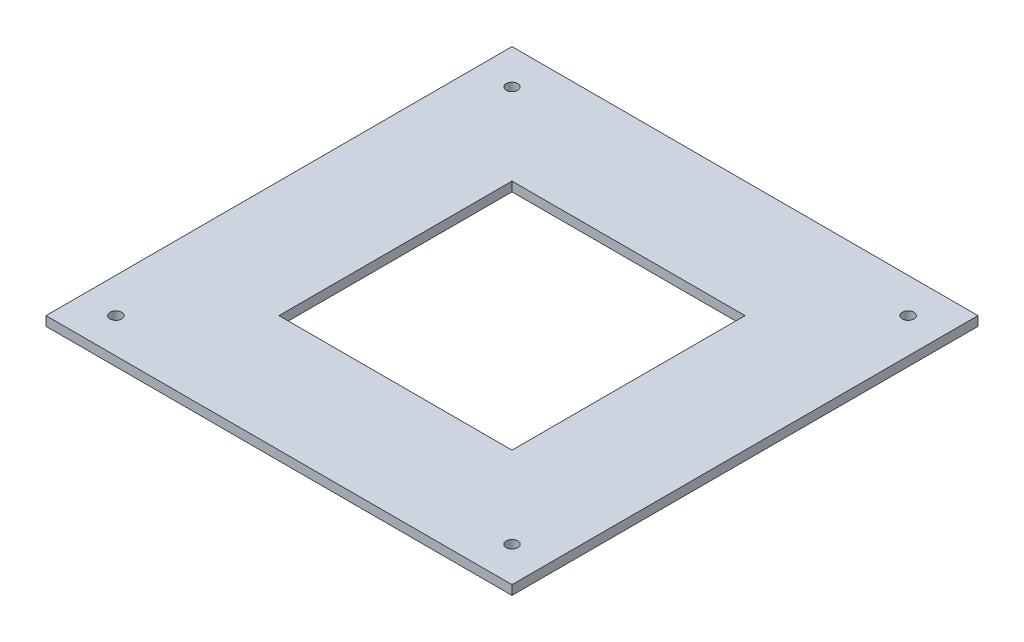
ISO-10303-21;
HEADER;
FILE_DESCRIPTION(('STEP AP214'),'2;1');
FILE_NAME('part.step','',(''),(''),'','','');
FILE_SCHEMA(('AUTOMOTIVE_DESIGN { 1 0 10303 214 1 1 1 1 }'));
ENDSEC;
DATA;
#1=APPLICATION_CONTEXT('core data for automotive mechanical design processes');
#2=APPLICATION_PROTOCOL_DEFINITION('international standard','automotive_design',2000,#1);
#3=PRODUCT_CONTEXT('',#1,'mechanical');
#4=PRODUCT('Part','Part','',(#3));
#5=PRODUCT_RELATED_PRODUCT_CATEGORY('part','',(#4));
#6=PRODUCT_DEFINITION_FORMATION('','',#4);
#7=PRODUCT_DEFINITION_CONTEXT('part definition',#1,'design');
#8=PRODUCT_DEFINITION('design','',#6,#7);
#9=PRODUCT_DEFINITION_SHAPE('','',#8);
#10=(LENGTH_UNIT() NAMED_UNIT(*) SI_UNIT(.MILLI.,.METRE.));
#11=(NAMED_UNIT(*) PLANE_ANGLE_UNIT() SI_UNIT($,.RADIAN.));
#12=(NAMED_UNIT(*) SI_UNIT($,.STERADIAN.) SOLID_ANGLE_UNIT());
#13=UNCERTAINTY_MEASURE_WITH_UNIT(LENGTH_MEASURE(1.E-05),#10,'distance_accuracy_value','');
#14=(GEOMETRIC_REPRESENTATION_CONTEXT(3) GLOBAL_UNCERTAINTY_ASSIGNED_CONTEXT((#13)) GLOBAL_UNIT_ASSIGNED_CONTEXT((#10,
#11,#12)) REPRESENTATION_CONTEXT('',''));
#15=CARTESIAN_POINT('',(0.,0.,0.));
#16=DIRECTION('',(0.,0.,1.));
#17=DIRECTION('',(1.,0.,0.));
#18=AXIS2_PLACEMENT_3D('',#15,#16,#17);
#19=CARTESIAN_POINT('',(0.,4.,0.));
#20=DIRECTION('',(0.,-1.,0.));
#21=DIRECTION('',(0.,0.,-1.));
#22=AXIS2_PLACEMENT_3D('',#19,#20,#21);
#23=PLANE('',#22);
#24=CARTESIAN_POINT('',(15.,4.,-15.));
#25=DIRECTION('',(0.,1.,0.));
#26=DIRECTION('',(0.,0.,1.));
#27=AXIS2_PLACEMENT_3D('',#24,#25,#26);
#28=CIRCLE('',#27,2.5);
#29=CARTESIAN_POINT('',(15.,4.,-12.5));
#30=VERTEX_POINT('',#29);
#31=EDGE_CURVE('E134',#30,#30,#28,.T.);
#32=ORIENTED_EDGE('',*,*,#31,.F.);
#33=EDGE_LOOP('',(#32));
#34=FACE_BOUND('',#33,.T.);
#35=CARTESIAN_POINT('',(185.,4.,-15.0000000000001));
#36=DIRECTION('',(0.,1.,0.));
#37=DIRECTION('',(0.,0.,1.));
#38=AXIS2_PLACEMENT_3D('',#35,#36,#37);
#39=CIRCLE('',#38,2.5);
#40=CARTESIAN_POINT('',(185.,4.,-12.5000000000001));
#41=VERTEX_POINT('',#40);
#42=EDGE_CURVE('E140',#41,#41,#39,.T.);
#43=ORIENTED_EDGE('',*,*,#42,.F.);
#44=EDGE_LOOP('',(#43));
#45=FACE_BOUND('',#44,.T.);
#46=CARTESIAN_POINT('',(185.,4.,-185.));
#47=DIRECTION('',(0.,1.,0.));
#48=DIRECTION('',(0.,0.,1.));
#49=AXIS2_PLACEMENT_3D('',#46,#47,#48);
#50=CIRCLE('',#49,2.5);
#51=CARTESIAN_POINT('',(185.,4.,-182.5));
#52=VERTEX_POINT('',#51);
#53=EDGE_CURVE('E146',#52,#52,#50,.T.);
#54=ORIENTED_EDGE('',*,*,#53,.F.);
#55=EDGE_LOOP('',(#54));
#56=FACE_BOUND('',#55,.T.);
#57=CARTESIAN_POINT('',(15.,4.,-185.));
#58=DIRECTION('',(0.,1.,0.));
#59=DIRECTION('',(0.,0.,1.));
#60=AXIS2_PLACEMENT_3D('',#57,#58,#59);
#61=CIRCLE('',#60,2.5);
#62=CARTESIAN_POINT('',(15.,4.,-182.5));
#63=VERTEX_POINT('',#62);
#64=EDGE_CURVE('E152',#63,#63,#61,.T.);
#65=ORIENTED_EDGE('',*,*,#64,.F.);
#66=EDGE_LOOP('',(#65));
#67=FACE_BOUND('',#66,.T.);
#68=DIRECTION('',(0.,0.,1.));
#69=VECTOR('',#68,1.);
#70=CARTESIAN_POINT('',(0.,4.,0.));
#71=LINE('',#70,#69);
#72=CARTESIAN_POINT('',(0.,4.,-200.));
#73=VERTEX_POINT('',#72);
#74=CARTESIAN_POINT('',(0.,4.,0.));
#75=VERTEX_POINT('',#74);
#76=EDGE_CURVE('E158',#73,#75,#71,.T.);
#77=ORIENTED_EDGE('',*,*,#76,.T.);
#78=DIRECTION('',(1.,0.,0.));
#79=VECTOR('',#78,1.);
#80=CARTESIAN_POINT('',(0.,4.,0.));
#81=LINE('',#80,#79);
#82=CARTESIAN_POINT('',(200.,4.,0.));
#83=VERTEX_POINT('',#82);
#84=EDGE_CURVE('E161',#75,#83,#81,.T.);
#85=ORIENTED_EDGE('',*,*,#84,.T.);
#86=DIRECTION('',(0.,0.,-1.));
#87=VECTOR('',#86,1.);
#88=CARTESIAN_POINT('',(200.,4.,0.));
#89=LINE('',#88,#87);
#90=CARTESIAN_POINT('',(200.,4.,-200.));
#91=VERTEX_POINT('',#90);
#92=EDGE_CURVE('E164',#83,#91,#89,.T.);
#93=ORIENTED_EDGE('',*,*,#92,.T.);
#94=DIRECTION('',(-1.,0.,0.));
#95=VECTOR('',#94,1.);
#96=CARTESIAN_POINT('',(0.,4.,-200.));
#97=LINE('',#96,#95);
#98=EDGE_CURVE('E166',#91,#73,#97,.T.);
#99=ORIENTED_EDGE('',*,*,#98,.T.);
#100=EDGE_LOOP('',(#77,#85,#93,#99));
#101=FACE_BOUND('',#100,.T.);
#102=DIRECTION('',(1.,0.,0.));
#103=VECTOR('',#102,1.);
#104=CARTESIAN_POINT('',(50.,4.,-150.));
#105=LINE('',#104,#103);
#106=CARTESIAN_POINT('',(50.,4.,-150.));
#107=VERTEX_POINT('',#106);
#108=CARTESIAN_POINT('',(150.,4.,-150.));
#109=VERTEX_POINT('',#108);
#110=EDGE_CURVE('E48',#107,#109,#105,.T.);
#111=ORIENTED_EDGE('',*,*,#110,.T.);
#112=DIRECTION('',(0.,0.,-1.));
#113=VECTOR('',#112,1.);
#114=CARTESIAN_POINT('',(150.,4.,-50.));
#115=LINE('',#114,#113);
#116=CARTESIAN_POINT('',(150.,4.,-50.));
#117=VERTEX_POINT('',#116);
#118=EDGE_CURVE('E113',#117,#109,#115,.T.);
#119=ORIENTED_EDGE('',*,*,#118,.F.);
#120=DIRECTION('',(1.,0.,0.));
#121=VECTOR('',#120,1.);
#122=CARTESIAN_POINT('',(50.,4.,-50.));
#123=LINE('',#122,#121);
#124=CARTESIAN_POINT('',(50.,4.,-50.));
#125=VERTEX_POINT('',#124);
#126=EDGE_CURVE('E125',#125,#117,#123,.T.);
#127=ORIENTED_EDGE('',*,*,#126,.F.);
#128=DIRECTION('',(0.,0.,-1.));
#129=VECTOR('',#128,1.);
#130=CARTESIAN_POINT('',(50.,4.,-50.));
#131=LINE('',#130,#129);
#132=EDGE_CURVE('E107',#125,#107,#131,.T.);
#133=ORIENTED_EDGE('',*,*,#132,.T.);
#134=EDGE_LOOP('',(#111,#119,#127,#133));
#135=FACE_BOUND('',#134,.T.);
#136=ADVANCED_FACE('F33',(#34,#45,#56,#67,#101,#135),#23,.F.);
#137=CARTESIAN_POINT('',(0.,0.,0.));
#138=DIRECTION('',(0.,-1.,0.));
#139=DIRECTION('',(0.,0.,-1.));
#140=AXIS2_PLACEMENT_3D('',#137,#138,#139);
#141=PLANE('',#140);
#142=CARTESIAN_POINT('',(185.,0.,-15.0000000000001));
#143=DIRECTION('',(0.,1.,0.));
#144=DIRECTION('',(0.,0.,1.));
#145=AXIS2_PLACEMENT_3D('',#142,#143,#144);
#146=CIRCLE('',#145,2.5);
#147=CARTESIAN_POINT('',(185.,0.,-12.5000000000001));
#148=VERTEX_POINT('',#147);
#149=EDGE_CURVE('E137',#148,#148,#146,.T.);
#150=ORIENTED_EDGE('',*,*,#149,.T.);
#151=EDGE_LOOP('',(#150));
#152=FACE_BOUND('',#151,.T.);
#153=CARTESIAN_POINT('',(15.,0.,-185.));
#154=DIRECTION('',(0.,1.,0.));
#155=DIRECTION('',(0.,0.,1.));
#156=AXIS2_PLACEMENT_3D('',#153,#154,#155);
#157=CIRCLE('',#156,2.5);
#158=CARTESIAN_POINT('',(15.,0.,-182.5));
#159=VERTEX_POINT('',#158);
#160=EDGE_CURVE('E149',#159,#159,#157,.T.);
#161=ORIENTED_EDGE('',*,*,#160,.T.);
#162=EDGE_LOOP('',(#161));
#163=FACE_BOUND('',#162,.T.);
#164=DIRECTION('',(0.,0.,1.));
#165=VECTOR('',#164,1.);
#166=CARTESIAN_POINT('',(0.,0.,0.));
#167=LINE('',#166,#165);
#168=CARTESIAN_POINT('',(0.,0.,-200.));
#169=VERTEX_POINT('',#168);
#170=CARTESIAN_POINT('',(0.,0.,0.));
#171=VERTEX_POINT('',#170);
#172=EDGE_CURVE('E155',#169,#171,#167,.T.);
#173=ORIENTED_EDGE('',*,*,#172,.F.);
#174=DIRECTION('',(-1.,0.,0.));
#175=VECTOR('',#174,1.);
#176=CARTESIAN_POINT('',(0.,0.,-200.));
#177=LINE('',#176,#175);
#178=CARTESIAN_POINT('',(200.,0.,-200.));
#179=VERTEX_POINT('',#178);
#180=EDGE_CURVE('E162',#179,#169,#177,.T.);
#181=ORIENTED_EDGE('',*,*,#180,.F.);
#182=DIRECTION('',(0.,0.,-1.));
#183=VECTOR('',#182,1.);
#184=CARTESIAN_POINT('',(200.,0.,0.));
#185=LINE('',#184,#183);
#186=CARTESIAN_POINT('',(200.,0.,0.));
#187=VERTEX_POINT('',#186);
#188=EDGE_CURVE('E173',#187,#179,#185,.T.);
#189=ORIENTED_EDGE('',*,*,#188,.F.);
#190=DIRECTION('',(1.,0.,0.));
#191=VECTOR('',#190,1.);
#192=CARTESIAN_POINT('',(0.,0.,0.));
#193=LINE('',#192,#191);
#194=EDGE_CURVE('E171',#171,#187,#193,.T.);
#195=ORIENTED_EDGE('',*,*,#194,.F.);
#196=EDGE_LOOP('',(#173,#181,#189,#195));
#197=FACE_BOUND('',#196,.T.);
#198=CARTESIAN_POINT('',(185.,0.,-185.));
#199=DIRECTION('',(0.,1.,0.));
#200=DIRECTION('',(0.,0.,1.));
#201=AXIS2_PLACEMENT_3D('',#198,#199,#200);
#202=CIRCLE('',#201,2.5);
#203=CARTESIAN_POINT('',(185.,0.,-182.5));
#204=VERTEX_POINT('',#203);
#205=EDGE_CURVE('E143',#204,#204,#202,.T.);
#206=ORIENTED_EDGE('',*,*,#205,.T.);
#207=EDGE_LOOP('',(#206));
#208=FACE_BOUND('',#207,.T.);
#209=CARTESIAN_POINT('',(15.,0.,-15.));
#210=DIRECTION('',(0.,1.,0.));
#211=DIRECTION('',(0.,0.,1.));
#212=AXIS2_PLACEMENT_3D('',#209,#210,#211);
#213=CIRCLE('',#212,2.5);
#214=CARTESIAN_POINT('',(15.,0.,-12.5));
#215=VERTEX_POINT('',#214);
#216=EDGE_CURVE('E114',#215,#215,#213,.T.);
#217=ORIENTED_EDGE('',*,*,#216,.T.);
#218=EDGE_LOOP('',(#217));
#219=FACE_BOUND('',#218,.T.);
#220=DIRECTION('',(0.,0.,-1.));
#221=VECTOR('',#220,1.);
#222=CARTESIAN_POINT('',(150.,0.,-50.));
#223=LINE('',#222,#221);
#224=CARTESIAN_POINT('',(150.,0.,-50.));
#225=VERTEX_POINT('',#224);
#226=CARTESIAN_POINT('',(150.,0.,-150.));
#227=VERTEX_POINT('',#226);
#228=EDGE_CURVE('E106',#225,#227,#223,.T.);
#229=ORIENTED_EDGE('',*,*,#228,.T.);
#230=DIRECTION('',(1.,0.,0.));
#231=VECTOR('',#230,1.);
#232=CARTESIAN_POINT('',(50.,0.,-150.));
#233=LINE('',#232,#231);
#234=CARTESIAN_POINT('',(50.,0.,-150.));
#235=VERTEX_POINT('',#234);
#236=EDGE_CURVE('E97',#235,#227,#233,.T.);
#237=ORIENTED_EDGE('',*,*,#236,.F.);
#238=DIRECTION('',(0.,0.,-1.));
#239=VECTOR('',#238,1.);
#240=CARTESIAN_POINT('',(50.,0.,-50.));
#241=LINE('',#240,#239);
#242=CARTESIAN_POINT('',(50.,0.,-50.));
#243=VERTEX_POINT('',#242);
#244=EDGE_CURVE('E119',#243,#235,#241,.T.);
#245=ORIENTED_EDGE('',*,*,#244,.F.);
#246=DIRECTION('',(1.,0.,0.));
#247=VECTOR('',#246,1.);
#248=CARTESIAN_POINT('',(50.,0.,-50.));
#249=LINE('',#248,#247);
#250=EDGE_CURVE('E56',#243,#225,#249,.T.);
#251=ORIENTED_EDGE('',*,*,#250,.T.);
#252=EDGE_LOOP('',(#229,#237,#245,#251));
#253=FACE_BOUND('',#252,.T.);
#254=ADVANCED_FACE('F117',(#152,#163,#197,#208,#219,#253),#141,.T.);
#255=CARTESIAN_POINT('',(0.,4.,0.));
#256=DIRECTION('',(1.,0.,0.));
#257=DIRECTION('',(0.,0.,-1.));
#258=AXIS2_PLACEMENT_3D('',#255,#256,#257);
#259=PLANE('',#258);
#260=ORIENTED_EDGE('',*,*,#172,.T.);
#261=DIRECTION('',(0.,-1.,0.));
#262=VECTOR('',#261,1.);
#263=CARTESIAN_POINT('',(0.,4.,0.));
#264=LINE('',#263,#262);
#265=EDGE_CURVE('E11',#75,#171,#264,.T.);
#266=ORIENTED_EDGE('',*,*,#265,.F.);
#267=ORIENTED_EDGE('',*,*,#76,.F.);
#268=DIRECTION('',(0.,-1.,0.));
#269=VECTOR('',#268,1.);
#270=CARTESIAN_POINT('',(0.,4.,-200.));
#271=LINE('',#270,#269);
#272=EDGE_CURVE('E168',#73,#169,#271,.T.);
#273=ORIENTED_EDGE('',*,*,#272,.T.);
#274=EDGE_LOOP('',(#260,#266,#267,#273));
#275=FACE_BOUND('',#274,.T.);
#276=ADVANCED_FACE('F35',(#275),#259,.F.);
#277=CARTESIAN_POINT('',(0.,4.,0.));
#278=DIRECTION('',(0.,0.,-1.));
#279=DIRECTION('',(-1.,0.,0.));
#280=AXIS2_PLACEMENT_3D('',#277,#278,#279);
#281=PLANE('',#280);
#282=ORIENTED_EDGE('',*,*,#194,.T.);
#283=DIRECTION('',(0.,-1.,0.));
#284=VECTOR('',#283,1.);
#285=CARTESIAN_POINT('',(200.,4.,0.));
#286=LINE('',#285,#284);
#287=EDGE_CURVE('E41',#83,#187,#286,.T.);
#288=ORIENTED_EDGE('',*,*,#287,.F.);
#289=ORIENTED_EDGE('',*,*,#84,.F.);
#290=ORIENTED_EDGE('',*,*,#265,.T.);
#291=EDGE_LOOP('',(#282,#288,#289,#290));
#292=FACE_BOUND('',#291,.T.);
#293=ADVANCED_FACE('F201',(#292),#281,.F.);
#294=CARTESIAN_POINT('',(200.,4.,0.));
#295=DIRECTION('',(-1.,0.,0.));
#296=DIRECTION('',(0.,0.,1.));
#297=AXIS2_PLACEMENT_3D('',#294,#295,#296);
#298=PLANE('',#297);
#299=ORIENTED_EDGE('',*,*,#188,.T.);
#300=DIRECTION('',(0.,-1.,0.));
#301=VECTOR('',#300,1.);
#302=CARTESIAN_POINT('',(200.,4.,-200.));
#303=LINE('',#302,#301);
#304=EDGE_CURVE('E178',#91,#179,#303,.T.);
#305=ORIENTED_EDGE('',*,*,#304,.F.);
#306=ORIENTED_EDGE('',*,*,#92,.F.);
#307=ORIENTED_EDGE('',*,*,#287,.T.);
#308=EDGE_LOOP('',(#299,#305,#306,#307));
#309=FACE_BOUND('',#308,.T.);
#310=ADVANCED_FACE('F185',(#309),#298,.F.);
#311=CARTESIAN_POINT('',(0.,4.,-200.));
#312=DIRECTION('',(0.,0.,1.));
#313=DIRECTION('',(1.,0.,0.));
#314=AXIS2_PLACEMENT_3D('',#311,#312,#313);
#315=PLANE('',#314);
#316=ORIENTED_EDGE('',*,*,#180,.T.);
#317=ORIENTED_EDGE('',*,*,#272,.F.);
#318=ORIENTED_EDGE('',*,*,#98,.F.);
#319=ORIENTED_EDGE('',*,*,#304,.T.);
#320=EDGE_LOOP('',(#316,#317,#318,#319));
#321=FACE_BOUND('',#320,.T.);
#322=ADVANCED_FACE('F194',(#321),#315,.F.);
#323=CARTESIAN_POINT('',(15.,4.,-185.));
#324=DIRECTION('',(0.,-1.,0.));
#325=DIRECTION('',(0.,0.,-1.));
#326=AXIS2_PLACEMENT_3D('',#323,#324,#325);
#327=CYLINDRICAL_SURFACE('',#326,2.5);
#328=ORIENTED_EDGE('',*,*,#64,.T.);
#329=EDGE_LOOP('',(#328));
#330=FACE_BOUND('',#329,.T.);
#331=ORIENTED_EDGE('',*,*,#160,.F.);
#332=EDGE_LOOP('',(#331));
#333=FACE_BOUND('',#332,.T.);
#334=ADVANCED_FACE('F219',(#330,#333),#327,.F.);
#335=CARTESIAN_POINT('',(185.,4.,-185.));
#336=DIRECTION('',(0.,-1.,0.));
#337=DIRECTION('',(0.,0.,-1.));
#338=AXIS2_PLACEMENT_3D('',#335,#336,#337);
#339=CYLINDRICAL_SURFACE('',#338,2.5);
#340=ORIENTED_EDGE('',*,*,#53,.T.);
#341=EDGE_LOOP('',(#340));
#342=FACE_BOUND('',#341,.T.);
#343=ORIENTED_EDGE('',*,*,#205,.F.);
#344=EDGE_LOOP('',(#343));
#345=FACE_BOUND('',#344,.T.);
#346=ADVANCED_FACE('F226',(#342,#345),#339,.F.);
#347=CARTESIAN_POINT('',(185.,4.,-15.0000000000001));
#348=DIRECTION('',(0.,-1.,0.));
#349=DIRECTION('',(0.,0.,-1.));
#350=AXIS2_PLACEMENT_3D('',#347,#348,#349);
#351=CYLINDRICAL_SURFACE('',#350,2.5);
#352=ORIENTED_EDGE('',*,*,#42,.T.);
#353=EDGE_LOOP('',(#352));
#354=FACE_BOUND('',#353,.T.);
#355=ORIENTED_EDGE('',*,*,#149,.F.);
#356=EDGE_LOOP('',(#355));
#357=FACE_BOUND('',#356,.T.);
#358=ADVANCED_FACE('F231',(#354,#357),#351,.F.);
#359=CARTESIAN_POINT('',(15.,4.,-15.));
#360=DIRECTION('',(0.,-1.,0.));
#361=DIRECTION('',(0.,0.,-1.));
#362=AXIS2_PLACEMENT_3D('',#359,#360,#361);
#363=CYLINDRICAL_SURFACE('',#362,2.5);
#364=ORIENTED_EDGE('',*,*,#31,.T.);
#365=EDGE_LOOP('',(#364));
#366=FACE_BOUND('',#365,.T.);
#367=ORIENTED_EDGE('',*,*,#216,.F.);
#368=EDGE_LOOP('',(#367));
#369=FACE_BOUND('',#368,.T.);
#370=ADVANCED_FACE('F241',(#366,#369),#363,.F.);
#371=CARTESIAN_POINT('',(50.,0.,-150.));
#372=DIRECTION('',(0.,0.,1.));
#373=DIRECTION('',(1.,0.,0.));
#374=AXIS2_PLACEMENT_3D('',#371,#372,#373);
#375=PLANE('',#374);
#376=ORIENTED_EDGE('',*,*,#110,.F.);
#377=DIRECTION('',(0.,1.,0.));
#378=VECTOR('',#377,1.);
#379=CARTESIAN_POINT('',(50.,0.,-150.));
#380=LINE('',#379,#378);
#381=EDGE_CURVE('E102',#235,#107,#380,.T.);
#382=ORIENTED_EDGE('',*,*,#381,.F.);
#383=ORIENTED_EDGE('',*,*,#236,.T.);
#384=DIRECTION('',(0.,1.,0.));
#385=VECTOR('',#384,1.);
#386=CARTESIAN_POINT('',(150.,0.,-150.));
#387=LINE('',#386,#385);
#388=EDGE_CURVE('E100',#227,#109,#387,.T.);
#389=ORIENTED_EDGE('',*,*,#388,.T.);
#390=EDGE_LOOP('',(#376,#382,#383,#389));
#391=FACE_BOUND('',#390,.T.);
#392=ADVANCED_FACE('F99',(#391),#375,.T.);
#393=CARTESIAN_POINT('',(150.,0.,-50.));
#394=DIRECTION('',(1.,0.,0.));
#395=DIRECTION('',(0.,0.,-1.));
#396=AXIS2_PLACEMENT_3D('',#393,#394,#395);
#397=PLANE('',#396);
#398=ORIENTED_EDGE('',*,*,#118,.T.);
#399=ORIENTED_EDGE('',*,*,#388,.F.);
#400=ORIENTED_EDGE('',*,*,#228,.F.);
#401=DIRECTION('',(0.,1.,0.));
#402=VECTOR('',#401,1.);
#403=CARTESIAN_POINT('',(150.,0.,-50.));
#404=LINE('',#403,#402);
#405=EDGE_CURVE('E115',#225,#117,#404,.T.);
#406=ORIENTED_EDGE('',*,*,#405,.T.);
#407=EDGE_LOOP('',(#398,#399,#400,#406));
#408=FACE_BOUND('',#407,.T.);
#409=ADVANCED_FACE('F111',(#408),#397,.F.);
#410=CARTESIAN_POINT('',(50.,0.,-50.));
#411=DIRECTION('',(0.,0.,1.));
#412=DIRECTION('',(1.,0.,0.));
#413=AXIS2_PLACEMENT_3D('',#410,#411,#412);
#414=PLANE('',#413);
#415=ORIENTED_EDGE('',*,*,#126,.T.);
#416=ORIENTED_EDGE('',*,*,#405,.F.);
#417=ORIENTED_EDGE('',*,*,#250,.F.);
#418=DIRECTION('',(0.,1.,0.));
#419=VECTOR('',#418,1.);
#420=CARTESIAN_POINT('',(50.,0.,-50.));
#421=LINE('',#420,#419);
#422=EDGE_CURVE('E131',#243,#125,#421,.T.);
#423=ORIENTED_EDGE('',*,*,#422,.T.);
#424=EDGE_LOOP('',(#415,#416,#417,#423));
#425=FACE_BOUND('',#424,.T.);
#426=ADVANCED_FACE('F253',(#425),#414,.F.);
#427=CARTESIAN_POINT('',(50.,0.,-50.));
#428=DIRECTION('',(1.,0.,0.));
#429=DIRECTION('',(0.,0.,-1.));
#430=AXIS2_PLACEMENT_3D('',#427,#428,#429);
#431=PLANE('',#430);
#432=ORIENTED_EDGE('',*,*,#132,.F.);
#433=ORIENTED_EDGE('',*,*,#422,.F.);
#434=ORIENTED_EDGE('',*,*,#244,.T.);
#435=ORIENTED_EDGE('',*,*,#381,.T.);
#436=EDGE_LOOP('',(#432,#433,#434,#435));
#437=FACE_BOUND('',#436,.T.);
#438=ADVANCED_FACE('F256',(#437),#431,.T.);
#439=CLOSED_SHELL('',(#136,#254,#276,#293,#310,#322,#334,#346,#358,#370,#392,#409,#426,#438));
#440=MANIFOLD_SOLID_BREP('B2',#439);
#441=ADVANCED_BREP_SHAPE_REPRESENTATION('',(#18,#440),#14);
#442=SHAPE_DEFINITION_REPRESENTATION(#9,#441);
ENDSEC;
END-ISO-10303-21;
